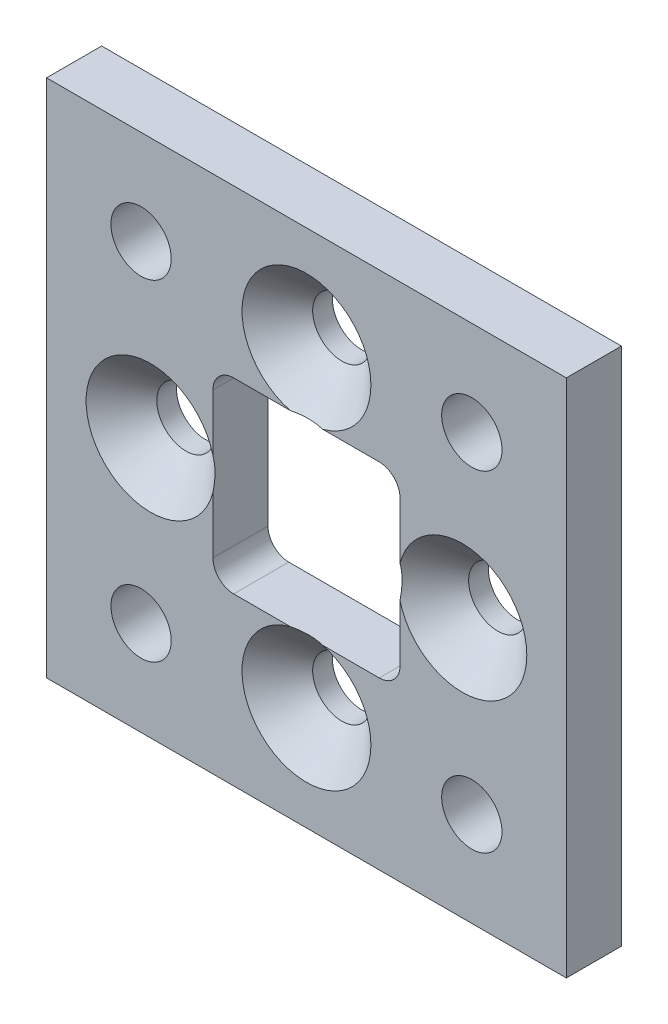
ISO-10303-21;
HEADER;
FILE_DESCRIPTION(('STEP AP214'),'2;1');
FILE_NAME('part.step','',(''),(''),'','','');
FILE_SCHEMA(('AUTOMOTIVE_DESIGN { 1 0 10303 214 1 1 1 1 }'));
ENDSEC;
DATA;
#1=APPLICATION_CONTEXT('core data for automotive mechanical design processes');
#2=APPLICATION_PROTOCOL_DEFINITION('international standard','automotive_design',2000,#1);
#3=PRODUCT_CONTEXT('',#1,'mechanical');
#4=PRODUCT('Part','Part','',(#3));
#5=PRODUCT_RELATED_PRODUCT_CATEGORY('part','',(#4));
#6=PRODUCT_DEFINITION_FORMATION('','',#4);
#7=PRODUCT_DEFINITION_CONTEXT('part definition',#1,'design');
#8=PRODUCT_DEFINITION('design','',#6,#7);
#9=PRODUCT_DEFINITION_SHAPE('','',#8);
#10=(LENGTH_UNIT() NAMED_UNIT(*) SI_UNIT(.MILLI.,.METRE.));
#11=(NAMED_UNIT(*) PLANE_ANGLE_UNIT() SI_UNIT($,.RADIAN.));
#12=(NAMED_UNIT(*) SI_UNIT($,.STERADIAN.) SOLID_ANGLE_UNIT());
#13=UNCERTAINTY_MEASURE_WITH_UNIT(LENGTH_MEASURE(1.E-05),#10,'distance_accuracy_value','');
#14=(GEOMETRIC_REPRESENTATION_CONTEXT(3) GLOBAL_UNCERTAINTY_ASSIGNED_CONTEXT((#13)) GLOBAL_UNIT_ASSIGNED_CONTEXT((#10,
#11,#12)) REPRESENTATION_CONTEXT('',''));
#15=CARTESIAN_POINT('',(0.,0.,0.));
#16=DIRECTION('',(0.,0.,1.));
#17=DIRECTION('',(1.,0.,0.));
#18=AXIS2_PLACEMENT_3D('',#15,#16,#17);
#19=CARTESIAN_POINT('',(0.,0.,2.65));
#20=DIRECTION('',(0.,0.,1.));
#21=DIRECTION('',(1.,0.,0.));
#22=AXIS2_PLACEMENT_3D('',#19,#20,#21);
#23=PLANE('',#22);
#24=CARTESIAN_POINT('',(-7.95495128834866,-7.95495128834866,2.65));
#25=DIRECTION('',(0.,0.,1.));
#26=DIRECTION('',(1.,0.,0.));
#27=AXIS2_PLACEMENT_3D('',#24,#25,#26);
#28=CIRCLE('',#27,1.45);
#29=CARTESIAN_POINT('',(-6.50495128834866,-7.95495128834866,2.65));
#30=VERTEX_POINT('',#29);
#31=EDGE_CURVE('E556',#30,#30,#28,.T.);
#32=ORIENTED_EDGE('',*,*,#31,.F.);
#33=EDGE_LOOP('',(#32));
#34=FACE_BOUND('',#33,.T.);
#35=CARTESIAN_POINT('',(7.95495128834866,7.95495128834866,2.65));
#36=DIRECTION('',(0.,0.,1.));
#37=DIRECTION('',(1.,0.,0.));
#38=AXIS2_PLACEMENT_3D('',#35,#36,#37);
#39=CIRCLE('',#38,1.45);
#40=CARTESIAN_POINT('',(9.40495128834866,7.95495128834866,2.65));
#41=VERTEX_POINT('',#40);
#42=EDGE_CURVE('E564',#41,#41,#39,.T.);
#43=ORIENTED_EDGE('',*,*,#42,.F.);
#44=EDGE_LOOP('',(#43));
#45=FACE_BOUND('',#44,.T.);
#46=DIRECTION('',(0.,1.,0.));
#47=VECTOR('',#46,1.);
#48=CARTESIAN_POINT('',(12.5,12.5,2.65));
#49=LINE('',#48,#47);
#50=CARTESIAN_POINT('',(12.5,-12.5,2.65));
#51=VERTEX_POINT('',#50);
#52=CARTESIAN_POINT('',(12.5,12.5,2.65));
#53=VERTEX_POINT('',#52);
#54=EDGE_CURVE('E162',#51,#53,#49,.T.);
#55=ORIENTED_EDGE('',*,*,#54,.T.);
#56=DIRECTION('',(-1.,0.,0.));
#57=VECTOR('',#56,1.);
#58=CARTESIAN_POINT('',(-12.5,12.5,2.65));
#59=LINE('',#58,#57);
#60=CARTESIAN_POINT('',(-12.5,12.5,2.65));
#61=VERTEX_POINT('',#60);
#62=EDGE_CURVE('E151',#53,#61,#59,.T.);
#63=ORIENTED_EDGE('',*,*,#62,.T.);
#64=DIRECTION('',(0.,-1.,0.));
#65=VECTOR('',#64,1.);
#66=CARTESIAN_POINT('',(-12.5,12.5,2.65));
#67=LINE('',#66,#65);
#68=CARTESIAN_POINT('',(-12.5,-12.5,2.65));
#69=VERTEX_POINT('',#68);
#70=EDGE_CURVE('E161',#61,#69,#67,.T.);
#71=ORIENTED_EDGE('',*,*,#70,.T.);
#72=DIRECTION('',(1.,0.,0.));
#73=VECTOR('',#72,1.);
#74=CARTESIAN_POINT('',(-12.5,-12.5,2.65));
#75=LINE('',#74,#73);
#76=EDGE_CURVE('E167',#69,#51,#75,.T.);
#77=ORIENTED_EDGE('',*,*,#76,.T.);
#78=EDGE_LOOP('',(#55,#63,#71,#77));
#79=FACE_BOUND('',#78,.T.);
#80=DIRECTION('',(1.,0.,0.));
#81=VECTOR('',#80,1.);
#82=CARTESIAN_POINT('',(-4.5,-4.5,2.65));
#83=LINE('',#82,#81);
#84=CARTESIAN_POINT('',(0.781024967590694,-4.5,2.65));
#85=VERTEX_POINT('',#84);
#86=CARTESIAN_POINT('',(3.5,-4.5,2.65));
#87=VERTEX_POINT('',#86);
#88=EDGE_CURVE('E491',#85,#87,#83,.T.);
#89=ORIENTED_EDGE('',*,*,#88,.F.);
#90=CARTESIAN_POINT('',(0.,-7.5,2.65));
#91=DIRECTION('',(0.,0.,1.));
#92=DIRECTION('',(1.,0.,0.));
#93=AXIS2_PLACEMENT_3D('',#90,#91,#92);
#94=CIRCLE('',#93,3.10000000000001);
#95=CARTESIAN_POINT('',(-0.781024967590695,-4.5,2.65));
#96=VERTEX_POINT('',#95);
#97=EDGE_CURVE('E193',#85,#96,#94,.F.);
#98=ORIENTED_EDGE('',*,*,#97,.T.);
#99=CARTESIAN_POINT('',(-3.5,-4.5,2.65));
#100=VERTEX_POINT('',#99);
#101=EDGE_CURVE('E492',#100,#96,#83,.T.);
#102=ORIENTED_EDGE('',*,*,#101,.F.);
#103=CARTESIAN_POINT('',(-3.5,-3.5,2.65));
#104=DIRECTION('',(0.,0.,1.));
#105=DIRECTION('',(1.,0.,0.));
#106=AXIS2_PLACEMENT_3D('',#103,#104,#105);
#107=CIRCLE('',#106,1.);
#108=CARTESIAN_POINT('',(-4.5,-3.5,2.65));
#109=VERTEX_POINT('',#108);
#110=EDGE_CURVE('E596',#100,#109,#107,.F.);
#111=ORIENTED_EDGE('',*,*,#110,.T.);
#112=DIRECTION('',(0.,-1.,0.));
#113=VECTOR('',#112,1.);
#114=CARTESIAN_POINT('',(-4.5,4.5,2.65));
#115=LINE('',#114,#113);
#116=CARTESIAN_POINT('',(-4.5,-0.781024967590689,2.65));
#117=VERTEX_POINT('',#116);
#118=EDGE_CURVE('E485',#117,#109,#115,.T.);
#119=ORIENTED_EDGE('',*,*,#118,.F.);
#120=CARTESIAN_POINT('',(-7.5,0.,2.65));
#121=DIRECTION('',(0.,0.,1.));
#122=DIRECTION('',(1.,0.,0.));
#123=AXIS2_PLACEMENT_3D('',#120,#121,#122);
#124=CIRCLE('',#123,3.10000000000001);
#125=CARTESIAN_POINT('',(-4.5,0.781024967590689,2.65));
#126=VERTEX_POINT('',#125);
#127=EDGE_CURVE('E187',#117,#126,#124,.F.);
#128=ORIENTED_EDGE('',*,*,#127,.T.);
#129=CARTESIAN_POINT('',(-4.5,3.5,2.65));
#130=VERTEX_POINT('',#129);
#131=EDGE_CURVE('E479',#130,#126,#115,.T.);
#132=ORIENTED_EDGE('',*,*,#131,.F.);
#133=CARTESIAN_POINT('',(-3.5,3.5,2.65));
#134=DIRECTION('',(0.,0.,1.));
#135=DIRECTION('',(1.,0.,0.));
#136=AXIS2_PLACEMENT_3D('',#133,#134,#135);
#137=CIRCLE('',#136,1.);
#138=CARTESIAN_POINT('',(-3.5,4.5,2.65));
#139=VERTEX_POINT('',#138);
#140=EDGE_CURVE('E11',#130,#139,#137,.F.);
#141=ORIENTED_EDGE('',*,*,#140,.T.);
#142=DIRECTION('',(-1.,0.,0.));
#143=VECTOR('',#142,1.);
#144=CARTESIAN_POINT('',(-4.5,4.5,2.65));
#145=LINE('',#144,#143);
#146=CARTESIAN_POINT('',(-0.781024967590706,4.5,2.65));
#147=VERTEX_POINT('',#146);
#148=EDGE_CURVE('E477',#147,#139,#145,.T.);
#149=ORIENTED_EDGE('',*,*,#148,.F.);
#150=CARTESIAN_POINT('',(0.,7.5,2.65));
#151=DIRECTION('',(0.,0.,1.));
#152=DIRECTION('',(1.,0.,0.));
#153=AXIS2_PLACEMENT_3D('',#150,#151,#152);
#154=CIRCLE('',#153,3.10000000000001);
#155=CARTESIAN_POINT('',(0.781024967590709,4.5,2.65));
#156=VERTEX_POINT('',#155);
#157=EDGE_CURVE('E179',#147,#156,#154,.F.);
#158=ORIENTED_EDGE('',*,*,#157,.T.);
#159=CARTESIAN_POINT('',(3.5,4.5,2.65));
#160=VERTEX_POINT('',#159);
#161=EDGE_CURVE('E482',#160,#156,#145,.T.);
#162=ORIENTED_EDGE('',*,*,#161,.F.);
#163=CARTESIAN_POINT('',(3.5,3.5,2.65));
#164=DIRECTION('',(0.,0.,1.));
#165=DIRECTION('',(1.,0.,0.));
#166=AXIS2_PLACEMENT_3D('',#163,#164,#165);
#167=CIRCLE('',#166,1.);
#168=CARTESIAN_POINT('',(4.5,3.5,2.65));
#169=VERTEX_POINT('',#168);
#170=EDGE_CURVE('E613',#160,#169,#167,.F.);
#171=ORIENTED_EDGE('',*,*,#170,.T.);
#172=DIRECTION('',(0.,1.,0.));
#173=VECTOR('',#172,1.);
#174=CARTESIAN_POINT('',(4.5,4.5,2.65));
#175=LINE('',#174,#173);
#176=CARTESIAN_POINT('',(4.5,0.78102496759072,2.65));
#177=VERTEX_POINT('',#176);
#178=EDGE_CURVE('E486',#177,#169,#175,.T.);
#179=ORIENTED_EDGE('',*,*,#178,.F.);
#180=CARTESIAN_POINT('',(7.5,0.,2.65));
#181=DIRECTION('',(0.,0.,1.));
#182=DIRECTION('',(1.,0.,0.));
#183=AXIS2_PLACEMENT_3D('',#180,#181,#182);
#184=CIRCLE('',#183,3.10000000000001);
#185=CARTESIAN_POINT('',(4.5,-0.78102496759072,2.65));
#186=VERTEX_POINT('',#185);
#187=EDGE_CURVE('E190',#177,#186,#184,.F.);
#188=ORIENTED_EDGE('',*,*,#187,.T.);
#189=CARTESIAN_POINT('',(4.5,-3.5,2.65));
#190=VERTEX_POINT('',#189);
#191=EDGE_CURVE('E483',#190,#186,#175,.T.);
#192=ORIENTED_EDGE('',*,*,#191,.F.);
#193=CARTESIAN_POINT('',(3.5,-3.5,2.65));
#194=DIRECTION('',(0.,0.,1.));
#195=DIRECTION('',(1.,0.,0.));
#196=AXIS2_PLACEMENT_3D('',#193,#194,#195);
#197=CIRCLE('',#196,1.);
#198=EDGE_CURVE('E616',#190,#87,#197,.F.);
#199=ORIENTED_EDGE('',*,*,#198,.T.);
#200=EDGE_LOOP('',(#89,#98,#102,#111,#119,#128,#132,#141,#149,#158,#162,#171,#179,#188,#192,#199));
#201=FACE_BOUND('',#200,.T.);
#202=CARTESIAN_POINT('',(7.95495128834866,-7.95495128834866,2.65));
#203=DIRECTION('',(0.,0.,1.));
#204=DIRECTION('',(1.,0.,0.));
#205=AXIS2_PLACEMENT_3D('',#202,#203,#204);
#206=CIRCLE('',#205,1.45);
#207=CARTESIAN_POINT('',(9.40495128834866,-7.95495128834866,2.65));
#208=VERTEX_POINT('',#207);
#209=EDGE_CURVE('E560',#208,#208,#206,.T.);
#210=ORIENTED_EDGE('',*,*,#209,.F.);
#211=EDGE_LOOP('',(#210));
#212=FACE_BOUND('',#211,.T.);
#213=CARTESIAN_POINT('',(-7.95495128834866,7.95495128834866,2.65));
#214=DIRECTION('',(0.,0.,1.));
#215=DIRECTION('',(1.,0.,0.));
#216=AXIS2_PLACEMENT_3D('',#213,#214,#215);
#217=CIRCLE('',#216,1.45);
#218=CARTESIAN_POINT('',(-6.50495128834866,7.95495128834866,2.65));
#219=VERTEX_POINT('',#218);
#220=EDGE_CURVE('E551',#219,#219,#217,.T.);
#221=ORIENTED_EDGE('',*,*,#220,.F.);
#222=EDGE_LOOP('',(#221));
#223=FACE_BOUND('',#222,.T.);
#224=ADVANCED_FACE('F38',(#34,#45,#79,#201,#212,#223),#23,.T.);
#225=CARTESIAN_POINT('',(0.,0.,0.));
#226=DIRECTION('',(0.,0.,1.));
#227=DIRECTION('',(1.,0.,0.));
#228=AXIS2_PLACEMENT_3D('',#225,#226,#227);
#229=PLANE('',#228);
#230=DIRECTION('',(0.,1.,0.));
#231=VECTOR('',#230,1.);
#232=CARTESIAN_POINT('',(12.5,12.5,0.));
#233=LINE('',#232,#231);
#234=CARTESIAN_POINT('',(12.5,-12.5,0.));
#235=VERTEX_POINT('',#234);
#236=CARTESIAN_POINT('',(12.5,12.5,0.));
#237=VERTEX_POINT('',#236);
#238=EDGE_CURVE('E175',#235,#237,#233,.T.);
#239=ORIENTED_EDGE('',*,*,#238,.F.);
#240=DIRECTION('',(1.,0.,0.));
#241=VECTOR('',#240,1.);
#242=CARTESIAN_POINT('',(-12.5,-12.5,0.));
#243=LINE('',#242,#241);
#244=CARTESIAN_POINT('',(-12.5,-12.5,0.));
#245=VERTEX_POINT('',#244);
#246=EDGE_CURVE('E171',#245,#235,#243,.T.);
#247=ORIENTED_EDGE('',*,*,#246,.F.);
#248=DIRECTION('',(0.,-1.,0.));
#249=VECTOR('',#248,1.);
#250=CARTESIAN_POINT('',(-12.5,12.5,0.));
#251=LINE('',#250,#249);
#252=CARTESIAN_POINT('',(-12.5,12.5,0.));
#253=VERTEX_POINT('',#252);
#254=EDGE_CURVE('E511',#253,#245,#251,.T.);
#255=ORIENTED_EDGE('',*,*,#254,.F.);
#256=DIRECTION('',(-1.,0.,0.));
#257=VECTOR('',#256,1.);
#258=CARTESIAN_POINT('',(-12.5,12.5,0.));
#259=LINE('',#258,#257);
#260=EDGE_CURVE('E509',#237,#253,#259,.T.);
#261=ORIENTED_EDGE('',*,*,#260,.F.);
#262=EDGE_LOOP('',(#239,#247,#255,#261));
#263=FACE_BOUND('',#262,.T.);
#264=DIRECTION('',(1.,0.,0.));
#265=VECTOR('',#264,1.);
#266=CARTESIAN_POINT('',(-4.5,-4.5,0.));
#267=LINE('',#266,#265);
#268=CARTESIAN_POINT('',(-3.5,-4.5,0.));
#269=VERTEX_POINT('',#268);
#270=CARTESIAN_POINT('',(3.5,-4.5,0.));
#271=VERTEX_POINT('',#270);
#272=EDGE_CURVE('E502',#269,#271,#267,.T.);
#273=ORIENTED_EDGE('',*,*,#272,.T.);
#274=CARTESIAN_POINT('',(3.5,-3.5,0.));
#275=DIRECTION('',(0.,0.,1.));
#276=DIRECTION('',(1.,0.,0.));
#277=AXIS2_PLACEMENT_3D('',#274,#275,#276);
#278=CIRCLE('',#277,1.);
#279=CARTESIAN_POINT('',(4.5,-3.5,0.));
#280=VERTEX_POINT('',#279);
#281=EDGE_CURVE('E583',#271,#280,#278,.T.);
#282=ORIENTED_EDGE('',*,*,#281,.T.);
#283=DIRECTION('',(0.,1.,0.));
#284=VECTOR('',#283,1.);
#285=CARTESIAN_POINT('',(4.5,4.5,0.));
#286=LINE('',#285,#284);
#287=CARTESIAN_POINT('',(4.5,3.5,0.));
#288=VERTEX_POINT('',#287);
#289=EDGE_CURVE('E494',#280,#288,#286,.T.);
#290=ORIENTED_EDGE('',*,*,#289,.T.);
#291=CARTESIAN_POINT('',(3.5,3.5,0.));
#292=DIRECTION('',(0.,0.,1.));
#293=DIRECTION('',(1.,0.,0.));
#294=AXIS2_PLACEMENT_3D('',#291,#292,#293);
#295=CIRCLE('',#294,1.);
#296=CARTESIAN_POINT('',(3.5,4.5,0.));
#297=VERTEX_POINT('',#296);
#298=EDGE_CURVE('E60',#288,#297,#295,.T.);
#299=ORIENTED_EDGE('',*,*,#298,.T.);
#300=DIRECTION('',(-1.,0.,0.));
#301=VECTOR('',#300,1.);
#302=CARTESIAN_POINT('',(-4.5,4.5,0.));
#303=LINE('',#302,#301);
#304=CARTESIAN_POINT('',(-3.5,4.5,0.));
#305=VERTEX_POINT('',#304);
#306=EDGE_CURVE('E496',#297,#305,#303,.T.);
#307=ORIENTED_EDGE('',*,*,#306,.T.);
#308=CARTESIAN_POINT('',(-3.5,3.5,0.));
#309=DIRECTION('',(0.,0.,1.));
#310=DIRECTION('',(1.,0.,0.));
#311=AXIS2_PLACEMENT_3D('',#308,#309,#310);
#312=CIRCLE('',#311,1.);
#313=CARTESIAN_POINT('',(-4.5,3.5,0.));
#314=VERTEX_POINT('',#313);
#315=EDGE_CURVE('E46',#305,#314,#312,.T.);
#316=ORIENTED_EDGE('',*,*,#315,.T.);
#317=DIRECTION('',(0.,-1.,0.));
#318=VECTOR('',#317,1.);
#319=CARTESIAN_POINT('',(-4.5,4.5,0.));
#320=LINE('',#319,#318);
#321=CARTESIAN_POINT('',(-4.5,-3.5,0.));
#322=VERTEX_POINT('',#321);
#323=EDGE_CURVE('E499',#314,#322,#320,.T.);
#324=ORIENTED_EDGE('',*,*,#323,.T.);
#325=CARTESIAN_POINT('',(-3.5,-3.5,0.));
#326=DIRECTION('',(0.,0.,1.));
#327=DIRECTION('',(1.,0.,0.));
#328=AXIS2_PLACEMENT_3D('',#325,#326,#327);
#329=CIRCLE('',#328,1.);
#330=EDGE_CURVE('E585',#322,#269,#329,.T.);
#331=ORIENTED_EDGE('',*,*,#330,.T.);
#332=EDGE_LOOP('',(#273,#282,#290,#299,#307,#316,#324,#331));
#333=FACE_BOUND('',#332,.T.);
#334=CARTESIAN_POINT('',(0.,7.5,0.));
#335=DIRECTION('',(0.,0.,1.));
#336=DIRECTION('',(1.,0.,0.));
#337=AXIS2_PLACEMENT_3D('',#334,#335,#336);
#338=CIRCLE('',#337,1.4);
#339=CARTESIAN_POINT('',(1.4,7.5,0.));
#340=VERTEX_POINT('',#339);
#341=EDGE_CURVE('E497',#340,#340,#338,.T.);
#342=ORIENTED_EDGE('',*,*,#341,.T.);
#343=EDGE_LOOP('',(#342));
#344=FACE_BOUND('',#343,.T.);
#345=CARTESIAN_POINT('',(7.5,0.,0.));
#346=DIRECTION('',(0.,0.,1.));
#347=DIRECTION('',(1.,0.,0.));
#348=AXIS2_PLACEMENT_3D('',#345,#346,#347);
#349=CIRCLE('',#348,1.4);
#350=CARTESIAN_POINT('',(8.9,0.,0.));
#351=VERTEX_POINT('',#350);
#352=EDGE_CURVE('E526',#351,#351,#349,.T.);
#353=ORIENTED_EDGE('',*,*,#352,.T.);
#354=EDGE_LOOP('',(#353));
#355=FACE_BOUND('',#354,.T.);
#356=CARTESIAN_POINT('',(0.,-7.5,0.));
#357=DIRECTION('',(0.,0.,1.));
#358=DIRECTION('',(1.,0.,0.));
#359=AXIS2_PLACEMENT_3D('',#356,#357,#358);
#360=CIRCLE('',#359,1.4);
#361=CARTESIAN_POINT('',(1.4,-7.5,0.));
#362=VERTEX_POINT('',#361);
#363=EDGE_CURVE('E530',#362,#362,#360,.T.);
#364=ORIENTED_EDGE('',*,*,#363,.T.);
#365=EDGE_LOOP('',(#364));
#366=FACE_BOUND('',#365,.T.);
#367=CARTESIAN_POINT('',(-7.5,0.,0.));
#368=DIRECTION('',(0.,0.,1.));
#369=DIRECTION('',(1.,0.,0.));
#370=AXIS2_PLACEMENT_3D('',#367,#368,#369);
#371=CIRCLE('',#370,1.4);
#372=CARTESIAN_POINT('',(-6.1,0.,0.));
#373=VERTEX_POINT('',#372);
#374=EDGE_CURVE('E534',#373,#373,#371,.T.);
#375=ORIENTED_EDGE('',*,*,#374,.T.);
#376=EDGE_LOOP('',(#375));
#377=FACE_BOUND('',#376,.T.);
#378=CARTESIAN_POINT('',(7.95495128834866,7.95495128834866,0.));
#379=DIRECTION('',(0.,0.,1.));
#380=DIRECTION('',(1.,0.,0.));
#381=AXIS2_PLACEMENT_3D('',#378,#379,#380);
#382=CIRCLE('',#381,1.45);
#383=CARTESIAN_POINT('',(9.40495128834866,7.95495128834866,0.));
#384=VERTEX_POINT('',#383);
#385=EDGE_CURVE('E538',#384,#384,#382,.T.);
#386=ORIENTED_EDGE('',*,*,#385,.T.);
#387=EDGE_LOOP('',(#386));
#388=FACE_BOUND('',#387,.T.);
#389=CARTESIAN_POINT('',(7.95495128834866,-7.95495128834866,0.));
#390=DIRECTION('',(0.,0.,1.));
#391=DIRECTION('',(1.,0.,0.));
#392=AXIS2_PLACEMENT_3D('',#389,#390,#391);
#393=CIRCLE('',#392,1.45);
#394=CARTESIAN_POINT('',(9.40495128834866,-7.95495128834866,0.));
#395=VERTEX_POINT('',#394);
#396=EDGE_CURVE('E542',#395,#395,#393,.T.);
#397=ORIENTED_EDGE('',*,*,#396,.T.);
#398=EDGE_LOOP('',(#397));
#399=FACE_BOUND('',#398,.T.);
#400=CARTESIAN_POINT('',(-7.95495128834866,-7.95495128834866,0.));
#401=DIRECTION('',(0.,0.,1.));
#402=DIRECTION('',(1.,0.,0.));
#403=AXIS2_PLACEMENT_3D('',#400,#401,#402);
#404=CIRCLE('',#403,1.45);
#405=CARTESIAN_POINT('',(-6.50495128834866,-7.95495128834866,0.));
#406=VERTEX_POINT('',#405);
#407=EDGE_CURVE('E546',#406,#406,#404,.T.);
#408=ORIENTED_EDGE('',*,*,#407,.T.);
#409=EDGE_LOOP('',(#408));
#410=FACE_BOUND('',#409,.T.);
#411=CARTESIAN_POINT('',(-7.95495128834866,7.95495128834866,0.));
#412=DIRECTION('',(0.,0.,1.));
#413=DIRECTION('',(1.,0.,0.));
#414=AXIS2_PLACEMENT_3D('',#411,#412,#413);
#415=CIRCLE('',#414,1.45);
#416=CARTESIAN_POINT('',(-6.50495128834866,7.95495128834866,0.));
#417=VERTEX_POINT('',#416);
#418=EDGE_CURVE('E549',#417,#417,#415,.T.);
#419=ORIENTED_EDGE('',*,*,#418,.T.);
#420=EDGE_LOOP('',(#419));
#421=FACE_BOUND('',#420,.T.);
#422=ADVANCED_FACE('F246',(#263,#333,#344,#355,#366,#377,#388,#399,#410,#421),#229,.F.);
#423=CARTESIAN_POINT('',(12.5,12.5,2.65));
#424=DIRECTION('',(-1.,0.,0.));
#425=DIRECTION('',(0.,-1.,0.));
#426=AXIS2_PLACEMENT_3D('',#423,#424,#425);
#427=PLANE('',#426);
#428=ORIENTED_EDGE('',*,*,#238,.T.);
#429=DIRECTION('',(0.,0.,-1.));
#430=VECTOR('',#429,1.);
#431=CARTESIAN_POINT('',(12.5,12.5,2.65));
#432=LINE('',#431,#430);
#433=EDGE_CURVE('E155',#53,#237,#432,.T.);
#434=ORIENTED_EDGE('',*,*,#433,.F.);
#435=ORIENTED_EDGE('',*,*,#54,.F.);
#436=DIRECTION('',(0.,0.,-1.));
#437=VECTOR('',#436,1.);
#438=CARTESIAN_POINT('',(12.5,-12.5,2.65));
#439=LINE('',#438,#437);
#440=EDGE_CURVE('E507',#51,#235,#439,.T.);
#441=ORIENTED_EDGE('',*,*,#440,.T.);
#442=EDGE_LOOP('',(#428,#434,#435,#441));
#443=FACE_BOUND('',#442,.T.);
#444=ADVANCED_FACE('F173',(#443),#427,.F.);
#445=CARTESIAN_POINT('',(-12.5,12.5,2.65));
#446=DIRECTION('',(0.,-1.,0.));
#447=DIRECTION('',(0.,0.,-1.));
#448=AXIS2_PLACEMENT_3D('',#445,#446,#447);
#449=PLANE('',#448);
#450=ORIENTED_EDGE('',*,*,#260,.T.);
#451=DIRECTION('',(0.,0.,-1.));
#452=VECTOR('',#451,1.);
#453=CARTESIAN_POINT('',(-12.5,12.5,2.65));
#454=LINE('',#453,#452);
#455=EDGE_CURVE('E158',#61,#253,#454,.T.);
#456=ORIENTED_EDGE('',*,*,#455,.F.);
#457=ORIENTED_EDGE('',*,*,#62,.F.);
#458=ORIENTED_EDGE('',*,*,#433,.T.);
#459=EDGE_LOOP('',(#450,#456,#457,#458));
#460=FACE_BOUND('',#459,.T.);
#461=ADVANCED_FACE('F153',(#460),#449,.F.);
#462=CARTESIAN_POINT('',(-12.5,12.5,2.65));
#463=DIRECTION('',(1.,0.,0.));
#464=DIRECTION('',(0.,1.,0.));
#465=AXIS2_PLACEMENT_3D('',#462,#463,#464);
#466=PLANE('',#465);
#467=ORIENTED_EDGE('',*,*,#254,.T.);
#468=DIRECTION('',(0.,0.,-1.));
#469=VECTOR('',#468,1.);
#470=CARTESIAN_POINT('',(-12.5,-12.5,2.65));
#471=LINE('',#470,#469);
#472=EDGE_CURVE('E181',#69,#245,#471,.T.);
#473=ORIENTED_EDGE('',*,*,#472,.F.);
#474=ORIENTED_EDGE('',*,*,#70,.F.);
#475=ORIENTED_EDGE('',*,*,#455,.T.);
#476=EDGE_LOOP('',(#467,#473,#474,#475));
#477=FACE_BOUND('',#476,.T.);
#478=ADVANCED_FACE('F253',(#477),#466,.F.);
#479=CARTESIAN_POINT('',(-12.5,-12.5,2.65));
#480=DIRECTION('',(0.,1.,0.));
#481=DIRECTION('',(0.,0.,1.));
#482=AXIS2_PLACEMENT_3D('',#479,#480,#481);
#483=PLANE('',#482);
#484=ORIENTED_EDGE('',*,*,#246,.T.);
#485=ORIENTED_EDGE('',*,*,#440,.F.);
#486=ORIENTED_EDGE('',*,*,#76,.F.);
#487=ORIENTED_EDGE('',*,*,#472,.T.);
#488=EDGE_LOOP('',(#484,#485,#486,#487));
#489=FACE_BOUND('',#488,.T.);
#490=ADVANCED_FACE('F241',(#489),#483,.F.);
#491=CARTESIAN_POINT('',(4.5,4.5,2.65));
#492=DIRECTION('',(-1.,0.,0.));
#493=DIRECTION('',(0.,-1.,0.));
#494=AXIS2_PLACEMENT_3D('',#491,#492,#493);
#495=PLANE('',#494);
#496=ORIENTED_EDGE('',*,*,#178,.T.);
#497=DIRECTION('',(0.,0.,-1.));
#498=VECTOR('',#497,1.);
#499=CARTESIAN_POINT('',(4.5,3.5,0.));
#500=LINE('',#499,#498);
#501=EDGE_CURVE('E599',#169,#288,#500,.T.);
#502=ORIENTED_EDGE('',*,*,#501,.T.);
#503=ORIENTED_EDGE('',*,*,#289,.F.);
#504=DIRECTION('',(0.,0.,-1.));
#505=VECTOR('',#504,1.);
#506=CARTESIAN_POINT('',(4.5,-3.5,2.65));
#507=LINE('',#506,#505);
#508=EDGE_CURVE('E597',#280,#190,#507,.F.);
#509=ORIENTED_EDGE('',*,*,#508,.T.);
#510=ORIENTED_EDGE('',*,*,#191,.T.);
#511=CARTESIAN_POINT('',(4.5,-0.781024967590721,2.65));
#512=CARTESIAN_POINT('',(4.5,-0.706016458492542,2.63107565304789));
#513=CARTESIAN_POINT('',(4.5,-0.630362500700739,2.61458929201313));
#514=CARTESIAN_POINT('',(4.5,-0.478039687754458,2.58693145778755));
#515=CARTESIAN_POINT('',(4.5,-0.401370167205498,2.575763666368));
#516=CARTESIAN_POINT('',(4.5,-0.24882098773037,2.55936241035833));
#517=CARTESIAN_POINT('',(4.5,-0.172952953805215,2.55402299018796));
#518=CARTESIAN_POINT('',(4.5,-0.0210727163457297,2.5491133537477));
#519=CARTESIAN_POINT('',(4.5,0.0549394061126932,2.54954051975777));
#520=CARTESIAN_POINT('',(4.5,0.239751647733427,2.55760330811997));
#521=CARTESIAN_POINT('',(4.5,0.348435537993999,2.56829287879206));
#522=CARTESIAN_POINT('',(4.5,0.510877474394992,2.59270532594771));
#523=CARTESIAN_POINT('',(4.5,0.565297212473962,2.60233437143375));
#524=CARTESIAN_POINT('',(4.5,0.673587607121501,2.62423363961151));
#525=CARTESIAN_POINT('',(4.5,0.72745841854878,2.63650309452008));
#526=CARTESIAN_POINT('',(4.5,0.78102496759072,2.65));
#527=B_SPLINE_CURVE_WITH_KNOTS('',3,(#511,#512,#513,#514,#515,#516,#517,#518,#519,#520,#521,
#522,#523,#524,#525,#526),.UNSPECIFIED.,.F.,.F.,(4,2,2,2,2,2,2,4),(0.,0.232080165232222,
0.464320754897691,0.692265200278321,0.920106174619283,1.24702799001262,1.41276960047189,
1.57846308124134),.UNSPECIFIED.);
#528=EDGE_CURVE('E226',#186,#177,#527,.T.);
#529=ORIENTED_EDGE('',*,*,#528,.T.);
#530=EDGE_LOOP('',(#496,#502,#503,#509,#510,#529));
#531=FACE_BOUND('',#530,.T.);
#532=ADVANCED_FACE('F235',(#531),#495,.T.);
#533=CARTESIAN_POINT('',(-4.5,4.5,2.65));
#534=DIRECTION('',(0.,-1.,0.));
#535=DIRECTION('',(0.,0.,-1.));
#536=AXIS2_PLACEMENT_3D('',#533,#534,#535);
#537=PLANE('',#536);
#538=ORIENTED_EDGE('',*,*,#306,.F.);
#539=DIRECTION('',(0.,0.,-1.));
#540=VECTOR('',#539,1.);
#541=CARTESIAN_POINT('',(3.5,4.5,2.65));
#542=LINE('',#541,#540);
#543=EDGE_CURVE('E608',#297,#160,#542,.F.);
#544=ORIENTED_EDGE('',*,*,#543,.T.);
#545=ORIENTED_EDGE('',*,*,#161,.T.);
#546=CARTESIAN_POINT('',(0.781024967590709,4.5,2.65));
#547=CARTESIAN_POINT('',(0.70601645849253,4.5,2.63107565304789));
#548=CARTESIAN_POINT('',(0.630362500700727,4.5,2.61458929201314));
#549=CARTESIAN_POINT('',(0.478039687754448,4.5,2.58693145778755));
#550=CARTESIAN_POINT('',(0.401370167205487,4.5,2.575763666368));
#551=CARTESIAN_POINT('',(0.24882098773036,4.5,2.55936241035834));
#552=CARTESIAN_POINT('',(0.172952953805206,4.5,2.55402299018797));
#553=CARTESIAN_POINT('',(0.0210727163457205,4.5,2.5491133537477));
#554=CARTESIAN_POINT('',(-0.0549394061127021,4.5,2.54954051975777));
#555=CARTESIAN_POINT('',(-0.239751647733432,4.5,2.55760330811997));
#556=CARTESIAN_POINT('',(-0.348435537994,4.5,2.56829287879207));
#557=CARTESIAN_POINT('',(-0.510877474394987,4.5,2.59270532594771));
#558=CARTESIAN_POINT('',(-0.565297212473955,4.5,2.60233437143375));
#559=CARTESIAN_POINT('',(-0.673587607121491,4.5,2.62423363961152));
#560=CARTESIAN_POINT('',(-0.727458418548768,4.5,2.63650309452008));
#561=CARTESIAN_POINT('',(-0.781024967590706,4.5,2.65));
#562=B_SPLINE_CURVE_WITH_KNOTS('',3,(#546,#547,#548,#549,#550,#551,#552,#553,#554,#555,#556,
#557,#558,#559,#560,#561),.UNSPECIFIED.,.F.,.F.,(4,2,2,2,2,2,2,4),(0.,0.232080165232221,
0.464320754897688,0.692265200278317,0.920106174619279,1.2470279900126,1.41276960047187,
1.57846308124131),.UNSPECIFIED.);
#563=EDGE_CURVE('E481',#156,#147,#562,.T.);
#564=ORIENTED_EDGE('',*,*,#563,.T.);
#565=ORIENTED_EDGE('',*,*,#148,.T.);
#566=DIRECTION('',(0.,0.,-1.));
#567=VECTOR('',#566,1.);
#568=CARTESIAN_POINT('',(-3.5,4.5,0.));
#569=LINE('',#568,#567);
#570=EDGE_CURVE('E471',#139,#305,#569,.T.);
#571=ORIENTED_EDGE('',*,*,#570,.T.);
#572=EDGE_LOOP('',(#538,#544,#545,#564,#565,#571));
#573=FACE_BOUND('',#572,.T.);
#574=ADVANCED_FACE('F240',(#573),#537,.T.);
#575=CARTESIAN_POINT('',(-4.5,4.5,2.65));
#576=DIRECTION('',(1.,0.,0.));
#577=DIRECTION('',(0.,1.,0.));
#578=AXIS2_PLACEMENT_3D('',#575,#576,#577);
#579=PLANE('',#578);
#580=ORIENTED_EDGE('',*,*,#118,.T.);
#581=DIRECTION('',(0.,0.,-1.));
#582=VECTOR('',#581,1.);
#583=CARTESIAN_POINT('',(-4.5,-3.5,0.));
#584=LINE('',#583,#582);
#585=EDGE_CURVE('E601',#109,#322,#584,.T.);
#586=ORIENTED_EDGE('',*,*,#585,.T.);
#587=ORIENTED_EDGE('',*,*,#323,.F.);
#588=DIRECTION('',(0.,0.,-1.));
#589=VECTOR('',#588,1.);
#590=CARTESIAN_POINT('',(-4.5,3.5,2.65));
#591=LINE('',#590,#589);
#592=EDGE_CURVE('E470',#314,#130,#591,.F.);
#593=ORIENTED_EDGE('',*,*,#592,.T.);
#594=ORIENTED_EDGE('',*,*,#131,.T.);
#595=CARTESIAN_POINT('',(-4.5,0.781024967590689,2.65));
#596=CARTESIAN_POINT('',(-4.5,0.70601645849251,2.63107565304789));
#597=CARTESIAN_POINT('',(-4.5,0.630362500700707,2.61458929201314));
#598=CARTESIAN_POINT('',(-4.5,0.478039687754428,2.58693145778755));
#599=CARTESIAN_POINT('',(-4.5,0.401370167205468,2.575763666368));
#600=CARTESIAN_POINT('',(-4.5,0.24882098773034,2.55936241035834));
#601=CARTESIAN_POINT('',(-4.5,0.172952953805186,2.55402299018797));
#602=CARTESIAN_POINT('',(-4.5,0.0210727163457004,2.5491133537477));
#603=CARTESIAN_POINT('',(-4.5,-0.0549394061127222,2.54954051975778));
#604=CARTESIAN_POINT('',(-4.5,-0.239751647733446,2.55760330811998));
#605=CARTESIAN_POINT('',(-4.5,-0.348435537994008,2.56829287879207));
#606=CARTESIAN_POINT('',(-4.5,-0.510877474394986,2.59270532594772));
#607=CARTESIAN_POINT('',(-4.5,-0.565297212473951,2.60233437143375));
#608=CARTESIAN_POINT('',(-4.5,-0.673587607121479,2.62423363961152));
#609=CARTESIAN_POINT('',(-4.5,-0.727458418548753,2.63650309452008));
#610=CARTESIAN_POINT('',(-4.5,-0.781024967590689,2.65));
#611=B_SPLINE_CURVE_WITH_KNOTS('',3,(#595,#596,#597,#598,#599,#600,#601,#602,#603,#604,#605,
#606,#607,#608,#609,#610),.UNSPECIFIED.,.F.,.F.,(4,2,2,2,2,2,2,4),(0.,0.232080165232221,
0.464320754897688,0.692265200278317,0.920106174619279,1.24702799001258,1.41276960047184,
1.57846308124127),.UNSPECIFIED.);
#612=EDGE_CURVE('E630',#126,#117,#611,.T.);
#613=ORIENTED_EDGE('',*,*,#612,.T.);
#614=EDGE_LOOP('',(#580,#586,#587,#593,#594,#613));
#615=FACE_BOUND('',#614,.T.);
#616=ADVANCED_FACE('F418',(#615),#579,.T.);
#617=CARTESIAN_POINT('',(-4.5,-4.5,2.65));
#618=DIRECTION('',(0.,1.,0.));
#619=DIRECTION('',(0.,0.,1.));
#620=AXIS2_PLACEMENT_3D('',#617,#618,#619);
#621=PLANE('',#620);
#622=ORIENTED_EDGE('',*,*,#272,.F.);
#623=DIRECTION('',(0.,0.,-1.));
#624=VECTOR('',#623,1.);
#625=CARTESIAN_POINT('',(-3.5,-4.5,2.65));
#626=LINE('',#625,#624);
#627=EDGE_CURVE('E588',#269,#100,#626,.F.);
#628=ORIENTED_EDGE('',*,*,#627,.T.);
#629=ORIENTED_EDGE('',*,*,#101,.T.);
#630=CARTESIAN_POINT('',(-0.781024967590695,-4.5,2.65));
#631=CARTESIAN_POINT('',(-0.706016458492516,-4.5,2.63107565304789));
#632=CARTESIAN_POINT('',(-0.630362500700713,-4.5,2.61458929201314));
#633=CARTESIAN_POINT('',(-0.478039687754433,-4.5,2.58693145778755));
#634=CARTESIAN_POINT('',(-0.401370167205473,-4.5,2.575763666368));
#635=CARTESIAN_POINT('',(-0.248820987730346,-4.5,2.55936241035834));
#636=CARTESIAN_POINT('',(-0.172952953805191,-4.5,2.55402299018797));
#637=CARTESIAN_POINT('',(-0.0210727163457062,-4.5,2.5491133537477));
#638=CARTESIAN_POINT('',(0.0549394061127164,-4.5,2.54954051975778));
#639=CARTESIAN_POINT('',(0.239751647733442,-4.5,2.55760330811998));
#640=CARTESIAN_POINT('',(0.348435537994006,-4.5,2.56829287879207));
#641=CARTESIAN_POINT('',(0.510877474394986,-4.5,2.59270532594772));
#642=CARTESIAN_POINT('',(0.565297212473952,-4.5,2.60233437143375));
#643=CARTESIAN_POINT('',(0.673587607121483,-4.5,2.62423363961152));
#644=CARTESIAN_POINT('',(0.727458418548758,-4.5,2.63650309452008));
#645=CARTESIAN_POINT('',(0.781024967590694,-4.5,2.65));
#646=B_SPLINE_CURVE_WITH_KNOTS('',3,(#630,#631,#632,#633,#634,#635,#636,#637,#638,#639,#640,
#641,#642,#643,#644,#645),.UNSPECIFIED.,.F.,.F.,(4,2,2,2,2,2,2,4),(0.,0.232080165232221,
0.464320754897688,0.692265200278317,0.920106174619278,1.24702799001259,1.41276960047185,
1.57846308124129),.UNSPECIFIED.);
#647=EDGE_CURVE('E196',#96,#85,#646,.T.);
#648=ORIENTED_EDGE('',*,*,#647,.T.);
#649=ORIENTED_EDGE('',*,*,#88,.T.);
#650=DIRECTION('',(0.,0.,-1.));
#651=VECTOR('',#650,1.);
#652=CARTESIAN_POINT('',(3.5,-4.5,0.));
#653=LINE('',#652,#651);
#654=EDGE_CURVE('E592',#87,#271,#653,.T.);
#655=ORIENTED_EDGE('',*,*,#654,.T.);
#656=EDGE_LOOP('',(#622,#628,#629,#648,#649,#655));
#657=FACE_BOUND('',#656,.T.);
#658=ADVANCED_FACE('F206',(#657),#621,.T.);
#659=CARTESIAN_POINT('',(0.,7.5,2.65));
#660=DIRECTION('',(0.,0.,-1.));
#661=DIRECTION('',(-1.,0.,0.));
#662=AXIS2_PLACEMENT_3D('',#659,#660,#661);
#663=CYLINDRICAL_SURFACE('',#662,1.4);
#664=CARTESIAN_POINT('',(0.,7.5,0.95));
#665=DIRECTION('',(0.,0.,1.));
#666=DIRECTION('',(1.,0.,0.));
#667=AXIS2_PLACEMENT_3D('',#664,#665,#666);
#668=CIRCLE('',#667,1.4);
#669=CARTESIAN_POINT('',(1.4,7.5,0.95));
#670=VERTEX_POINT('',#669);
#671=EDGE_CURVE('E627',#670,#670,#668,.T.);
#672=ORIENTED_EDGE('',*,*,#671,.T.);
#673=EDGE_LOOP('',(#672));
#674=FACE_BOUND('',#673,.T.);
#675=ORIENTED_EDGE('',*,*,#341,.F.);
#676=EDGE_LOOP('',(#675));
#677=FACE_BOUND('',#676,.T.);
#678=ADVANCED_FACE('F340',(#674,#677),#663,.F.);
#679=CARTESIAN_POINT('',(7.5,0.,2.65));
#680=DIRECTION('',(0.,0.,-1.));
#681=DIRECTION('',(-1.,0.,0.));
#682=AXIS2_PLACEMENT_3D('',#679,#680,#681);
#683=CYLINDRICAL_SURFACE('',#682,1.4);
#684=CARTESIAN_POINT('',(7.5,0.,0.94999999999997));
#685=DIRECTION('',(0.,0.,1.));
#686=DIRECTION('',(1.,0.,0.));
#687=AXIS2_PLACEMENT_3D('',#684,#685,#686);
#688=CIRCLE('',#687,1.4);
#689=CARTESIAN_POINT('',(8.9,0.,0.94999999999997));
#690=VERTEX_POINT('',#689);
#691=EDGE_CURVE('E204',#690,#690,#688,.T.);
#692=ORIENTED_EDGE('',*,*,#691,.T.);
#693=EDGE_LOOP('',(#692));
#694=FACE_BOUND('',#693,.T.);
#695=ORIENTED_EDGE('',*,*,#352,.F.);
#696=EDGE_LOOP('',(#695));
#697=FACE_BOUND('',#696,.T.);
#698=ADVANCED_FACE('F330',(#694,#697),#683,.F.);
#699=CARTESIAN_POINT('',(0.,-7.5,2.65));
#700=DIRECTION('',(0.,0.,-1.));
#701=DIRECTION('',(-1.,0.,0.));
#702=AXIS2_PLACEMENT_3D('',#699,#700,#701);
#703=CYLINDRICAL_SURFACE('',#702,1.4);
#704=CARTESIAN_POINT('',(0.,-7.5,0.95));
#705=DIRECTION('',(0.,0.,1.));
#706=DIRECTION('',(1.,0.,0.));
#707=AXIS2_PLACEMENT_3D('',#704,#705,#706);
#708=CIRCLE('',#707,1.4);
#709=CARTESIAN_POINT('',(1.4,-7.5,0.95));
#710=VERTEX_POINT('',#709);
#711=EDGE_CURVE('E176',#710,#710,#708,.T.);
#712=ORIENTED_EDGE('',*,*,#711,.T.);
#713=EDGE_LOOP('',(#712));
#714=FACE_BOUND('',#713,.T.);
#715=ORIENTED_EDGE('',*,*,#363,.F.);
#716=EDGE_LOOP('',(#715));
#717=FACE_BOUND('',#716,.T.);
#718=ADVANCED_FACE('F318',(#714,#717),#703,.F.);
#719=CARTESIAN_POINT('',(-7.5,0.,2.65));
#720=DIRECTION('',(0.,0.,-1.));
#721=DIRECTION('',(-1.,0.,0.));
#722=AXIS2_PLACEMENT_3D('',#719,#720,#721);
#723=CYLINDRICAL_SURFACE('',#722,1.4);
#724=CARTESIAN_POINT('',(-7.5,0.,0.95));
#725=DIRECTION('',(0.,0.,1.));
#726=DIRECTION('',(1.,0.,0.));
#727=AXIS2_PLACEMENT_3D('',#724,#725,#726);
#728=CIRCLE('',#727,1.4);
#729=CARTESIAN_POINT('',(-6.1,0.,0.95));
#730=VERTEX_POINT('',#729);
#731=EDGE_CURVE('E233',#730,#730,#728,.T.);
#732=ORIENTED_EDGE('',*,*,#731,.T.);
#733=EDGE_LOOP('',(#732));
#734=FACE_BOUND('',#733,.T.);
#735=ORIENTED_EDGE('',*,*,#374,.F.);
#736=EDGE_LOOP('',(#735));
#737=FACE_BOUND('',#736,.T.);
#738=ADVANCED_FACE('F312',(#734,#737),#723,.F.);
#739=CARTESIAN_POINT('',(7.95495128834866,7.95495128834866,2.65));
#740=DIRECTION('',(0.,0.,-1.));
#741=DIRECTION('',(-1.,0.,0.));
#742=AXIS2_PLACEMENT_3D('',#739,#740,#741);
#743=CYLINDRICAL_SURFACE('',#742,1.45);
#744=ORIENTED_EDGE('',*,*,#42,.T.);
#745=EDGE_LOOP('',(#744));
#746=FACE_BOUND('',#745,.T.);
#747=ORIENTED_EDGE('',*,*,#385,.F.);
#748=EDGE_LOOP('',(#747));
#749=FACE_BOUND('',#748,.T.);
#750=ADVANCED_FACE('F317',(#746,#749),#743,.F.);
#751=CARTESIAN_POINT('',(7.95495128834866,-7.95495128834866,2.65));
#752=DIRECTION('',(0.,0.,-1.));
#753=DIRECTION('',(-1.,0.,0.));
#754=AXIS2_PLACEMENT_3D('',#751,#752,#753);
#755=CYLINDRICAL_SURFACE('',#754,1.45);
#756=ORIENTED_EDGE('',*,*,#209,.T.);
#757=EDGE_LOOP('',(#756));
#758=FACE_BOUND('',#757,.T.);
#759=ORIENTED_EDGE('',*,*,#396,.F.);
#760=EDGE_LOOP('',(#759));
#761=FACE_BOUND('',#760,.T.);
#762=ADVANCED_FACE('F368',(#758,#761),#755,.F.);
#763=CARTESIAN_POINT('',(-7.95495128834866,-7.95495128834866,2.65));
#764=DIRECTION('',(0.,0.,-1.));
#765=DIRECTION('',(-1.,0.,0.));
#766=AXIS2_PLACEMENT_3D('',#763,#764,#765);
#767=CYLINDRICAL_SURFACE('',#766,1.45);
#768=ORIENTED_EDGE('',*,*,#31,.T.);
#769=EDGE_LOOP('',(#768));
#770=FACE_BOUND('',#769,.T.);
#771=ORIENTED_EDGE('',*,*,#407,.F.);
#772=EDGE_LOOP('',(#771));
#773=FACE_BOUND('',#772,.T.);
#774=ADVANCED_FACE('F358',(#770,#773),#767,.F.);
#775=CARTESIAN_POINT('',(-7.95495128834866,7.95495128834866,2.65));
#776=DIRECTION('',(0.,0.,-1.));
#777=DIRECTION('',(-1.,0.,0.));
#778=AXIS2_PLACEMENT_3D('',#775,#776,#777);
#779=CYLINDRICAL_SURFACE('',#778,1.45);
#780=ORIENTED_EDGE('',*,*,#220,.T.);
#781=EDGE_LOOP('',(#780));
#782=FACE_BOUND('',#781,.T.);
#783=ORIENTED_EDGE('',*,*,#418,.F.);
#784=EDGE_LOOP('',(#783));
#785=FACE_BOUND('',#784,.T.);
#786=ADVANCED_FACE('F216',(#782,#785),#779,.F.);
#787=CARTESIAN_POINT('',(0.,-7.5,0.95));
#788=DIRECTION('',(0.,0.,1.));
#789=DIRECTION('',(1.,0.,0.));
#790=AXIS2_PLACEMENT_3D('',#787,#788,#789);
#791=CONICAL_SURFACE('',#790,1.4,0.785398163397451);
#792=ORIENTED_EDGE('',*,*,#647,.F.);
#793=ORIENTED_EDGE('',*,*,#97,.F.);
#794=EDGE_LOOP('',(#792,#793));
#795=FACE_BOUND('',#794,.T.);
#796=ORIENTED_EDGE('',*,*,#711,.F.);
#797=EDGE_LOOP('',(#796));
#798=FACE_BOUND('',#797,.T.);
#799=ADVANCED_FACE('F210',(#795,#798),#791,.F.);
#800=CARTESIAN_POINT('',(7.5,0.,0.94999999999997));
#801=DIRECTION('',(0.,0.,1.));
#802=DIRECTION('',(1.,0.,0.));
#803=AXIS2_PLACEMENT_3D('',#800,#801,#802);
#804=CONICAL_SURFACE('',#803,1.4,0.785398163397443);
#805=ORIENTED_EDGE('',*,*,#528,.F.);
#806=ORIENTED_EDGE('',*,*,#187,.F.);
#807=EDGE_LOOP('',(#805,#806));
#808=FACE_BOUND('',#807,.T.);
#809=ORIENTED_EDGE('',*,*,#691,.F.);
#810=EDGE_LOOP('',(#809));
#811=FACE_BOUND('',#810,.T.);
#812=ADVANCED_FACE('F215',(#808,#811),#804,.F.);
#813=CARTESIAN_POINT('',(-7.5,0.,0.95));
#814=DIRECTION('',(0.,0.,1.));
#815=DIRECTION('',(1.,0.,0.));
#816=AXIS2_PLACEMENT_3D('',#813,#814,#815);
#817=CONICAL_SURFACE('',#816,1.4,0.785398163397451);
#818=ORIENTED_EDGE('',*,*,#612,.F.);
#819=ORIENTED_EDGE('',*,*,#127,.F.);
#820=EDGE_LOOP('',(#818,#819));
#821=FACE_BOUND('',#820,.T.);
#822=ORIENTED_EDGE('',*,*,#731,.F.);
#823=EDGE_LOOP('',(#822));
#824=FACE_BOUND('',#823,.T.);
#825=ADVANCED_FACE('F222',(#821,#824),#817,.F.);
#826=CARTESIAN_POINT('',(0.,7.5,0.95));
#827=DIRECTION('',(0.,0.,1.));
#828=DIRECTION('',(1.,0.,0.));
#829=AXIS2_PLACEMENT_3D('',#826,#827,#828);
#830=CONICAL_SURFACE('',#829,1.4,0.785398163397451);
#831=ORIENTED_EDGE('',*,*,#563,.F.);
#832=ORIENTED_EDGE('',*,*,#157,.F.);
#833=EDGE_LOOP('',(#831,#832));
#834=FACE_BOUND('',#833,.T.);
#835=ORIENTED_EDGE('',*,*,#671,.F.);
#836=EDGE_LOOP('',(#835));
#837=FACE_BOUND('',#836,.T.);
#838=ADVANCED_FACE('F278',(#834,#837),#830,.F.);
#839=CARTESIAN_POINT('',(-3.5,-3.5,2.65));
#840=DIRECTION('',(0.,0.,1.));
#841=DIRECTION('',(1.,0.,0.));
#842=AXIS2_PLACEMENT_3D('',#839,#840,#841);
#843=CYLINDRICAL_SURFACE('',#842,1.);
#844=ORIENTED_EDGE('',*,*,#110,.F.);
#845=ORIENTED_EDGE('',*,*,#627,.F.);
#846=ORIENTED_EDGE('',*,*,#330,.F.);
#847=ORIENTED_EDGE('',*,*,#585,.F.);
#848=EDGE_LOOP('',(#844,#845,#846,#847));
#849=FACE_BOUND('',#848,.T.);
#850=ADVANCED_FACE('F283',(#849),#843,.F.);
#851=CARTESIAN_POINT('',(3.5,3.5,2.65));
#852=DIRECTION('',(0.,0.,1.));
#853=DIRECTION('',(1.,0.,0.));
#854=AXIS2_PLACEMENT_3D('',#851,#852,#853);
#855=CYLINDRICAL_SURFACE('',#854,1.);
#856=ORIENTED_EDGE('',*,*,#170,.F.);
#857=ORIENTED_EDGE('',*,*,#543,.F.);
#858=ORIENTED_EDGE('',*,*,#298,.F.);
#859=ORIENTED_EDGE('',*,*,#501,.F.);
#860=EDGE_LOOP('',(#856,#857,#858,#859));
#861=FACE_BOUND('',#860,.T.);
#862=ADVANCED_FACE('F439',(#861),#855,.F.);
#863=CARTESIAN_POINT('',(3.5,-3.5,2.65));
#864=DIRECTION('',(0.,0.,1.));
#865=DIRECTION('',(1.,0.,0.));
#866=AXIS2_PLACEMENT_3D('',#863,#864,#865);
#867=CYLINDRICAL_SURFACE('',#866,1.);
#868=ORIENTED_EDGE('',*,*,#198,.F.);
#869=ORIENTED_EDGE('',*,*,#508,.F.);
#870=ORIENTED_EDGE('',*,*,#281,.F.);
#871=ORIENTED_EDGE('',*,*,#654,.F.);
#872=EDGE_LOOP('',(#868,#869,#870,#871));
#873=FACE_BOUND('',#872,.T.);
#874=ADVANCED_FACE('F449',(#873),#867,.F.);
#875=CARTESIAN_POINT('',(-3.5,3.5,2.65));
#876=DIRECTION('',(0.,0.,1.));
#877=DIRECTION('',(1.,0.,0.));
#878=AXIS2_PLACEMENT_3D('',#875,#876,#877);
#879=CYLINDRICAL_SURFACE('',#878,1.);
#880=ORIENTED_EDGE('',*,*,#140,.F.);
#881=ORIENTED_EDGE('',*,*,#592,.F.);
#882=ORIENTED_EDGE('',*,*,#315,.F.);
#883=ORIENTED_EDGE('',*,*,#570,.F.);
#884=EDGE_LOOP('',(#880,#881,#882,#883));
#885=FACE_BOUND('',#884,.T.);
#886=ADVANCED_FACE('F40',(#885),#879,.F.);
#887=CLOSED_SHELL('',(#224,#422,#444,#461,#478,#490,#532,#574,#616,#658,#678,#698,#718,#738,
#750,#762,#774,#786,#799,#812,#825,#838,#850,#862,#874,#886));
#888=MANIFOLD_SOLID_BREP('B2',#887);
#889=ADVANCED_BREP_SHAPE_REPRESENTATION('',(#18,#888),#14);
#890=SHAPE_DEFINITION_REPRESENTATION(#9,#889);
ENDSEC;
END-ISO-10303-21;
